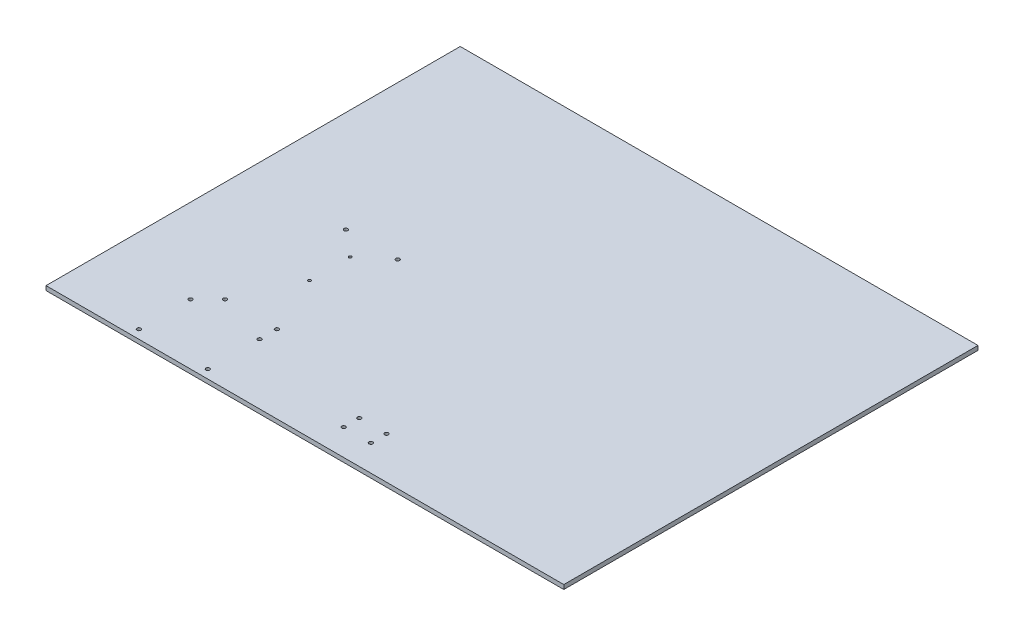
ISO-10303-21;
HEADER;
FILE_DESCRIPTION(('STEP AP214'),'2;1');
FILE_NAME('part.step','',(''),(''),'','','');
FILE_SCHEMA(('AUTOMOTIVE_DESIGN { 1 0 10303 214 1 1 1 1 }'));
ENDSEC;
DATA;
#1=APPLICATION_CONTEXT('core data for automotive mechanical design processes');
#2=APPLICATION_PROTOCOL_DEFINITION('international standard','automotive_design',2000,#1);
#3=PRODUCT_CONTEXT('',#1,'mechanical');
#4=PRODUCT('Part','Part','',(#3));
#5=PRODUCT_RELATED_PRODUCT_CATEGORY('part','',(#4));
#6=PRODUCT_DEFINITION_FORMATION('','',#4);
#7=PRODUCT_DEFINITION_CONTEXT('part definition',#1,'design');
#8=PRODUCT_DEFINITION('design','',#6,#7);
#9=PRODUCT_DEFINITION_SHAPE('','',#8);
#10=(LENGTH_UNIT() NAMED_UNIT(*) SI_UNIT(.MILLI.,.METRE.));
#11=(NAMED_UNIT(*) PLANE_ANGLE_UNIT() SI_UNIT($,.RADIAN.));
#12=(NAMED_UNIT(*) SI_UNIT($,.STERADIAN.) SOLID_ANGLE_UNIT());
#13=UNCERTAINTY_MEASURE_WITH_UNIT(LENGTH_MEASURE(1.E-05),#10,'distance_accuracy_value','');
#14=(GEOMETRIC_REPRESENTATION_CONTEXT(3) GLOBAL_UNCERTAINTY_ASSIGNED_CONTEXT((#13)) GLOBAL_UNIT_ASSIGNED_CONTEXT((#10,
#11,#12)) REPRESENTATION_CONTEXT('',''));
#15=CARTESIAN_POINT('',(0.,0.,0.));
#16=DIRECTION('',(0.,0.,1.));
#17=DIRECTION('',(1.,0.,0.));
#18=AXIS2_PLACEMENT_3D('',#15,#16,#17);
#19=CARTESIAN_POINT('',(0.,0.,0.));
#20=DIRECTION('',(0.,-1.,0.));
#21=DIRECTION('',(0.,0.,-1.));
#22=AXIS2_PLACEMENT_3D('',#19,#20,#21);
#23=PLANE('',#22);
#24=CARTESIAN_POINT('',(187.3758,0.,-260.35));
#25=DIRECTION('',(0.,1.,0.));
#26=DIRECTION('',(0.,0.,1.));
#27=AXIS2_PLACEMENT_3D('',#24,#25,#26);
#28=CIRCLE('',#27,2.09999999999999);
#29=CARTESIAN_POINT('',(187.3758,0.,-258.25));
#30=VERTEX_POINT('',#29);
#31=EDGE_CURVE('E196',#30,#30,#28,.T.);
#32=ORIENTED_EDGE('',*,*,#31,.T.);
#33=EDGE_LOOP('',(#32));
#34=FACE_BOUND('',#33,.T.);
#35=CARTESIAN_POINT('',(187.3758,0.,-200.3552));
#36=DIRECTION('',(0.,1.,0.));
#37=DIRECTION('',(0.,0.,1.));
#38=AXIS2_PLACEMENT_3D('',#35,#36,#37);
#39=CIRCLE('',#38,2.09999999999999);
#40=CARTESIAN_POINT('',(187.3758,0.,-198.2552));
#41=VERTEX_POINT('',#40);
#42=EDGE_CURVE('E190',#41,#41,#39,.T.);
#43=ORIENTED_EDGE('',*,*,#42,.T.);
#44=EDGE_LOOP('',(#43));
#45=FACE_BOUND('',#44,.T.);
#46=CARTESIAN_POINT('',(123.8758,0.,-12.7));
#47=DIRECTION('',(0.,1.,0.));
#48=DIRECTION('',(0.,0.,1.));
#49=AXIS2_PLACEMENT_3D('',#46,#47,#48);
#50=CIRCLE('',#49,2.74999999999999);
#51=CARTESIAN_POINT('',(123.8758,0.,-9.95000000000001));
#52=VERTEX_POINT('',#51);
#53=EDGE_CURVE('E184',#52,#52,#50,.T.);
#54=ORIENTED_EDGE('',*,*,#53,.T.);
#55=EDGE_LOOP('',(#54));
#56=FACE_BOUND('',#55,.T.);
#57=CARTESIAN_POINT('',(225.4758,0.,-12.7));
#58=DIRECTION('',(0.,1.,0.));
#59=DIRECTION('',(0.,0.,1.));
#60=AXIS2_PLACEMENT_3D('',#57,#58,#59);
#61=CIRCLE('',#60,2.75);
#62=CARTESIAN_POINT('',(225.4758,0.,-9.94999999999998));
#63=VERTEX_POINT('',#62);
#64=EDGE_CURVE('E178',#63,#63,#61,.T.);
#65=ORIENTED_EDGE('',*,*,#64,.T.);
#66=EDGE_LOOP('',(#65));
#67=FACE_BOUND('',#66,.T.);
#68=CARTESIAN_POINT('',(225.4758,0.,-88.9));
#69=DIRECTION('',(0.,1.,0.));
#70=DIRECTION('',(0.,0.,1.));
#71=AXIS2_PLACEMENT_3D('',#68,#69,#70);
#72=CIRCLE('',#71,2.75);
#73=CARTESIAN_POINT('',(225.4758,0.,-86.15));
#74=VERTEX_POINT('',#73);
#75=EDGE_CURVE('E172',#74,#74,#72,.T.);
#76=ORIENTED_EDGE('',*,*,#75,.T.);
#77=EDGE_LOOP('',(#76));
#78=FACE_BOUND('',#77,.T.);
#79=CARTESIAN_POINT('',(225.4758,0.,-292.1));
#80=DIRECTION('',(0.,1.,0.));
#81=DIRECTION('',(0.,0.,1.));
#82=AXIS2_PLACEMENT_3D('',#79,#80,#81);
#83=CIRCLE('',#82,2.75);
#84=CARTESIAN_POINT('',(225.4758,0.,-289.35));
#85=VERTEX_POINT('',#84);
#86=EDGE_CURVE('E154',#85,#85,#83,.T.);
#87=ORIENTED_EDGE('',*,*,#86,.T.);
#88=EDGE_LOOP('',(#87));
#89=FACE_BOUND('',#88,.T.);
#90=CARTESIAN_POINT('',(149.2758,0.,-292.1));
#91=DIRECTION('',(0.,1.,0.));
#92=DIRECTION('',(0.,0.,1.));
#93=AXIS2_PLACEMENT_3D('',#90,#91,#92);
#94=CIRCLE('',#93,2.75);
#95=CARTESIAN_POINT('',(149.2758,0.,-289.35));
#96=VERTEX_POINT('',#95);
#97=EDGE_CURVE('E148',#96,#96,#94,.T.);
#98=ORIENTED_EDGE('',*,*,#97,.T.);
#99=EDGE_LOOP('',(#98));
#100=FACE_BOUND('',#99,.T.);
#101=CARTESIAN_POINT('',(149.2758,0.,-114.3));
#102=DIRECTION('',(0.,1.,0.));
#103=DIRECTION('',(0.,0.,1.));
#104=AXIS2_PLACEMENT_3D('',#101,#102,#103);
#105=CIRCLE('',#104,2.75);
#106=CARTESIAN_POINT('',(149.2758,0.,-111.55));
#107=VERTEX_POINT('',#106);
#108=EDGE_CURVE('E142',#107,#107,#105,.T.);
#109=ORIENTED_EDGE('',*,*,#108,.T.);
#110=EDGE_LOOP('',(#109));
#111=FACE_BOUND('',#110,.T.);
#112=CARTESIAN_POINT('',(439.4454,0.,-61.6712));
#113=DIRECTION('',(0.,1.,0.));
#114=DIRECTION('',(0.,0.,1.));
#115=AXIS2_PLACEMENT_3D('',#112,#113,#114);
#116=CIRCLE('',#115,2.74999999999997);
#117=CARTESIAN_POINT('',(439.4454,0.,-58.9212));
#118=VERTEX_POINT('',#117);
#119=EDGE_CURVE('E136',#118,#118,#116,.T.);
#120=ORIENTED_EDGE('',*,*,#119,.T.);
#121=EDGE_LOOP('',(#120));
#122=FACE_BOUND('',#121,.T.);
#123=CARTESIAN_POINT('',(399.4404,0.,-61.6712));
#124=DIRECTION('',(0.,1.,0.));
#125=DIRECTION('',(0.,0.,1.));
#126=AXIS2_PLACEMENT_3D('',#123,#124,#125);
#127=CIRCLE('',#126,2.74999999999997);
#128=CARTESIAN_POINT('',(399.4404,0.,-58.9212000000001));
#129=VERTEX_POINT('',#128);
#130=EDGE_CURVE('E130',#129,#129,#127,.T.);
#131=ORIENTED_EDGE('',*,*,#130,.T.);
#132=EDGE_LOOP('',(#131));
#133=FACE_BOUND('',#132,.T.);
#134=CARTESIAN_POINT('',(399.4404,0.,-38.6588));
#135=DIRECTION('',(0.,1.,0.));
#136=DIRECTION('',(0.,0.,1.));
#137=AXIS2_PLACEMENT_3D('',#134,#135,#136);
#138=CIRCLE('',#137,2.74999999999997);
#139=CARTESIAN_POINT('',(399.4404,0.,-35.9088));
#140=VERTEX_POINT('',#139);
#141=EDGE_CURVE('E124',#140,#140,#138,.T.);
#142=ORIENTED_EDGE('',*,*,#141,.T.);
#143=EDGE_LOOP('',(#142));
#144=FACE_BOUND('',#143,.T.);
#145=CARTESIAN_POINT('',(439.4454,0.,-38.6588));
#146=DIRECTION('',(0.,1.,0.));
#147=DIRECTION('',(0.,0.,1.));
#148=AXIS2_PLACEMENT_3D('',#145,#146,#147);
#149=CIRCLE('',#148,2.74999999999997);
#150=CARTESIAN_POINT('',(439.4454,0.,-35.9088));
#151=VERTEX_POINT('',#150);
#152=EDGE_CURVE('E108',#151,#151,#149,.T.);
#153=ORIENTED_EDGE('',*,*,#152,.T.);
#154=EDGE_LOOP('',(#153));
#155=FACE_BOUND('',#154,.T.);
#156=DIRECTION('',(0.,0.,1.));
#157=VECTOR('',#156,1.);
#158=CARTESIAN_POINT('',(0.,0.,0.));
#159=LINE('',#158,#157);
#160=CARTESIAN_POINT('',(0.,0.,-609.6));
#161=VERTEX_POINT('',#160);
#162=CARTESIAN_POINT('',(0.,0.,0.));
#163=VERTEX_POINT('',#162);
#164=EDGE_CURVE('E105',#161,#163,#159,.T.);
#165=ORIENTED_EDGE('',*,*,#164,.F.);
#166=DIRECTION('',(-1.,0.,0.));
#167=VECTOR('',#166,1.);
#168=CARTESIAN_POINT('',(0.,0.,-609.6));
#169=LINE('',#168,#167);
#170=CARTESIAN_POINT('',(762.,0.,-609.6));
#171=VERTEX_POINT('',#170);
#172=EDGE_CURVE('E80',#171,#161,#169,.T.);
#173=ORIENTED_EDGE('',*,*,#172,.F.);
#174=DIRECTION('',(0.,0.,-1.));
#175=VECTOR('',#174,1.);
#176=CARTESIAN_POINT('',(762.,0.,0.));
#177=LINE('',#176,#175);
#178=CARTESIAN_POINT('',(762.,0.,0.));
#179=VERTEX_POINT('',#178);
#180=EDGE_CURVE('E74',#179,#171,#177,.T.);
#181=ORIENTED_EDGE('',*,*,#180,.F.);
#182=DIRECTION('',(1.,0.,0.));
#183=VECTOR('',#182,1.);
#184=CARTESIAN_POINT('',(0.,0.,0.));
#185=LINE('',#184,#183);
#186=EDGE_CURVE('E97',#163,#179,#185,.T.);
#187=ORIENTED_EDGE('',*,*,#186,.F.);
#188=EDGE_LOOP('',(#165,#173,#181,#187));
#189=FACE_BOUND('',#188,.T.);
#190=CARTESIAN_POINT('',(225.4758,0.,-114.3));
#191=DIRECTION('',(0.,1.,0.));
#192=DIRECTION('',(0.,0.,1.));
#193=AXIS2_PLACEMENT_3D('',#190,#191,#192);
#194=CIRCLE('',#193,2.75);
#195=CARTESIAN_POINT('',(225.4758,0.,-111.55));
#196=VERTEX_POINT('',#195);
#197=EDGE_CURVE('E160',#196,#196,#194,.T.);
#198=ORIENTED_EDGE('',*,*,#197,.T.);
#199=EDGE_LOOP('',(#198));
#200=FACE_BOUND('',#199,.T.);
#201=CARTESIAN_POINT('',(123.8758,0.,-88.9));
#202=DIRECTION('',(0.,1.,0.));
#203=DIRECTION('',(0.,0.,1.));
#204=AXIS2_PLACEMENT_3D('',#201,#202,#203);
#205=CIRCLE('',#204,2.74999999999999);
#206=CARTESIAN_POINT('',(123.8758,0.,-86.15));
#207=VERTEX_POINT('',#206);
#208=EDGE_CURVE('E166',#207,#207,#205,.T.);
#209=ORIENTED_EDGE('',*,*,#208,.T.);
#210=EDGE_LOOP('',(#209));
#211=FACE_BOUND('',#210,.T.);
#212=ADVANCED_FACE('F40',(#34,#45,#56,#67,#78,#89,#100,#111,#122,#133,#144,#155,#189,#200,#211),
#23,.T.);
#213=CARTESIAN_POINT('',(0.,6.35,0.));
#214=DIRECTION('',(0.,-1.,0.));
#215=DIRECTION('',(0.,0.,-1.));
#216=AXIS2_PLACEMENT_3D('',#213,#214,#215);
#217=PLANE('',#216);
#218=CARTESIAN_POINT('',(187.3758,6.35,-260.35));
#219=DIRECTION('',(0.,1.,0.));
#220=DIRECTION('',(0.,0.,1.));
#221=AXIS2_PLACEMENT_3D('',#218,#219,#220);
#222=CIRCLE('',#221,2.09999999999999);
#223=CARTESIAN_POINT('',(187.3758,6.35,-258.25));
#224=VERTEX_POINT('',#223);
#225=EDGE_CURVE('E199',#224,#224,#222,.T.);
#226=ORIENTED_EDGE('',*,*,#225,.F.);
#227=EDGE_LOOP('',(#226));
#228=FACE_BOUND('',#227,.T.);
#229=CARTESIAN_POINT('',(187.3758,6.35,-200.3552));
#230=DIRECTION('',(0.,1.,0.));
#231=DIRECTION('',(0.,0.,1.));
#232=AXIS2_PLACEMENT_3D('',#229,#230,#231);
#233=CIRCLE('',#232,2.09999999999999);
#234=CARTESIAN_POINT('',(187.3758,6.35,-198.2552));
#235=VERTEX_POINT('',#234);
#236=EDGE_CURVE('E193',#235,#235,#233,.T.);
#237=ORIENTED_EDGE('',*,*,#236,.F.);
#238=EDGE_LOOP('',(#237));
#239=FACE_BOUND('',#238,.T.);
#240=CARTESIAN_POINT('',(123.8758,6.35,-12.7));
#241=DIRECTION('',(0.,1.,0.));
#242=DIRECTION('',(0.,0.,1.));
#243=AXIS2_PLACEMENT_3D('',#240,#241,#242);
#244=CIRCLE('',#243,2.74999999999999);
#245=CARTESIAN_POINT('',(123.8758,6.35,-9.95000000000001));
#246=VERTEX_POINT('',#245);
#247=EDGE_CURVE('E187',#246,#246,#244,.T.);
#248=ORIENTED_EDGE('',*,*,#247,.F.);
#249=EDGE_LOOP('',(#248));
#250=FACE_BOUND('',#249,.T.);
#251=CARTESIAN_POINT('',(225.4758,6.35,-12.7));
#252=DIRECTION('',(0.,1.,0.));
#253=DIRECTION('',(0.,0.,1.));
#254=AXIS2_PLACEMENT_3D('',#251,#252,#253);
#255=CIRCLE('',#254,2.74999999999997);
#256=CARTESIAN_POINT('',(225.4758,6.35,-9.95));
#257=VERTEX_POINT('',#256);
#258=EDGE_CURVE('E181',#257,#257,#255,.T.);
#259=ORIENTED_EDGE('',*,*,#258,.F.);
#260=EDGE_LOOP('',(#259));
#261=FACE_BOUND('',#260,.T.);
#262=CARTESIAN_POINT('',(225.4758,6.35,-88.9));
#263=DIRECTION('',(0.,1.,0.));
#264=DIRECTION('',(0.,0.,1.));
#265=AXIS2_PLACEMENT_3D('',#262,#263,#264);
#266=CIRCLE('',#265,2.74999999999997);
#267=CARTESIAN_POINT('',(225.4758,6.35,-86.15));
#268=VERTEX_POINT('',#267);
#269=EDGE_CURVE('E175',#268,#268,#266,.T.);
#270=ORIENTED_EDGE('',*,*,#269,.F.);
#271=EDGE_LOOP('',(#270));
#272=FACE_BOUND('',#271,.T.);
#273=CARTESIAN_POINT('',(123.8758,6.35,-88.9));
#274=DIRECTION('',(0.,1.,0.));
#275=DIRECTION('',(0.,0.,1.));
#276=AXIS2_PLACEMENT_3D('',#273,#274,#275);
#277=CIRCLE('',#276,2.74999999999999);
#278=CARTESIAN_POINT('',(123.8758,6.35,-86.15));
#279=VERTEX_POINT('',#278);
#280=EDGE_CURVE('E169',#279,#279,#277,.T.);
#281=ORIENTED_EDGE('',*,*,#280,.F.);
#282=EDGE_LOOP('',(#281));
#283=FACE_BOUND('',#282,.T.);
#284=CARTESIAN_POINT('',(225.4758,6.35,-292.1));
#285=DIRECTION('',(0.,1.,0.));
#286=DIRECTION('',(0.,0.,1.));
#287=AXIS2_PLACEMENT_3D('',#284,#285,#286);
#288=CIRCLE('',#287,2.74999999999997);
#289=CARTESIAN_POINT('',(225.4758,6.35,-289.35));
#290=VERTEX_POINT('',#289);
#291=EDGE_CURVE('E157',#290,#290,#288,.T.);
#292=ORIENTED_EDGE('',*,*,#291,.F.);
#293=EDGE_LOOP('',(#292));
#294=FACE_BOUND('',#293,.T.);
#295=CARTESIAN_POINT('',(149.2758,6.35,-292.1));
#296=DIRECTION('',(0.,1.,0.));
#297=DIRECTION('',(0.,0.,1.));
#298=AXIS2_PLACEMENT_3D('',#295,#296,#297);
#299=CIRCLE('',#298,2.74999999999997);
#300=CARTESIAN_POINT('',(149.2758,6.35,-289.35));
#301=VERTEX_POINT('',#300);
#302=EDGE_CURVE('E151',#301,#301,#299,.T.);
#303=ORIENTED_EDGE('',*,*,#302,.F.);
#304=EDGE_LOOP('',(#303));
#305=FACE_BOUND('',#304,.T.);
#306=CARTESIAN_POINT('',(149.2758,6.35,-114.3));
#307=DIRECTION('',(0.,1.,0.));
#308=DIRECTION('',(0.,0.,1.));
#309=AXIS2_PLACEMENT_3D('',#306,#307,#308);
#310=CIRCLE('',#309,2.74999999999997);
#311=CARTESIAN_POINT('',(149.2758,6.35,-111.55));
#312=VERTEX_POINT('',#311);
#313=EDGE_CURVE('E145',#312,#312,#310,.T.);
#314=ORIENTED_EDGE('',*,*,#313,.F.);
#315=EDGE_LOOP('',(#314));
#316=FACE_BOUND('',#315,.T.);
#317=CARTESIAN_POINT('',(439.4454,6.35,-61.6712));
#318=DIRECTION('',(0.,1.,0.));
#319=DIRECTION('',(0.,0.,1.));
#320=AXIS2_PLACEMENT_3D('',#317,#318,#319);
#321=CIRCLE('',#320,2.74999999999997);
#322=CARTESIAN_POINT('',(439.4454,6.35,-58.9212));
#323=VERTEX_POINT('',#322);
#324=EDGE_CURVE('E139',#323,#323,#321,.T.);
#325=ORIENTED_EDGE('',*,*,#324,.F.);
#326=EDGE_LOOP('',(#325));
#327=FACE_BOUND('',#326,.T.);
#328=CARTESIAN_POINT('',(399.4404,6.35,-61.6712));
#329=DIRECTION('',(0.,1.,0.));
#330=DIRECTION('',(0.,0.,1.));
#331=AXIS2_PLACEMENT_3D('',#328,#329,#330);
#332=CIRCLE('',#331,2.74999999999997);
#333=CARTESIAN_POINT('',(399.4404,6.35,-58.9212000000001));
#334=VERTEX_POINT('',#333);
#335=EDGE_CURVE('E133',#334,#334,#332,.T.);
#336=ORIENTED_EDGE('',*,*,#335,.F.);
#337=EDGE_LOOP('',(#336));
#338=FACE_BOUND('',#337,.T.);
#339=CARTESIAN_POINT('',(399.4404,6.35,-38.6588));
#340=DIRECTION('',(0.,1.,0.));
#341=DIRECTION('',(0.,0.,1.));
#342=AXIS2_PLACEMENT_3D('',#339,#340,#341);
#343=CIRCLE('',#342,2.74999999999997);
#344=CARTESIAN_POINT('',(399.4404,6.35,-35.9088));
#345=VERTEX_POINT('',#344);
#346=EDGE_CURVE('E127',#345,#345,#343,.T.);
#347=ORIENTED_EDGE('',*,*,#346,.F.);
#348=EDGE_LOOP('',(#347));
#349=FACE_BOUND('',#348,.T.);
#350=CARTESIAN_POINT('',(439.4454,6.35,-38.6588));
#351=DIRECTION('',(0.,1.,0.));
#352=DIRECTION('',(0.,0.,1.));
#353=AXIS2_PLACEMENT_3D('',#350,#351,#352);
#354=CIRCLE('',#353,2.74999999999997);
#355=CARTESIAN_POINT('',(439.4454,6.35,-35.9088));
#356=VERTEX_POINT('',#355);
#357=EDGE_CURVE('E121',#356,#356,#354,.T.);
#358=ORIENTED_EDGE('',*,*,#357,.F.);
#359=EDGE_LOOP('',(#358));
#360=FACE_BOUND('',#359,.T.);
#361=DIRECTION('',(0.,0.,1.));
#362=VECTOR('',#361,1.);
#363=CARTESIAN_POINT('',(0.,6.35,0.));
#364=LINE('',#363,#362);
#365=CARTESIAN_POINT('',(0.,6.35,-609.6));
#366=VERTEX_POINT('',#365);
#367=CARTESIAN_POINT('',(0.,6.35,0.));
#368=VERTEX_POINT('',#367);
#369=EDGE_CURVE('E93',#366,#368,#364,.T.);
#370=ORIENTED_EDGE('',*,*,#369,.T.);
#371=DIRECTION('',(1.,0.,0.));
#372=VECTOR('',#371,1.);
#373=CARTESIAN_POINT('',(0.,6.35,0.));
#374=LINE('',#373,#372);
#375=CARTESIAN_POINT('',(762.,6.35,0.));
#376=VERTEX_POINT('',#375);
#377=EDGE_CURVE('E87',#368,#376,#374,.T.);
#378=ORIENTED_EDGE('',*,*,#377,.T.);
#379=DIRECTION('',(0.,0.,-1.));
#380=VECTOR('',#379,1.);
#381=CARTESIAN_POINT('',(762.,6.35,0.));
#382=LINE('',#381,#380);
#383=CARTESIAN_POINT('',(762.,6.35,-609.6));
#384=VERTEX_POINT('',#383);
#385=EDGE_CURVE('E91',#376,#384,#382,.T.);
#386=ORIENTED_EDGE('',*,*,#385,.T.);
#387=DIRECTION('',(-1.,0.,0.));
#388=VECTOR('',#387,1.);
#389=CARTESIAN_POINT('',(0.,6.35,-609.6));
#390=LINE('',#389,#388);
#391=EDGE_CURVE('E57',#384,#366,#390,.T.);
#392=ORIENTED_EDGE('',*,*,#391,.T.);
#393=EDGE_LOOP('',(#370,#378,#386,#392));
#394=FACE_BOUND('',#393,.T.);
#395=CARTESIAN_POINT('',(225.4758,6.35,-114.3));
#396=DIRECTION('',(0.,1.,0.));
#397=DIRECTION('',(0.,0.,1.));
#398=AXIS2_PLACEMENT_3D('',#395,#396,#397);
#399=CIRCLE('',#398,2.74999999999997);
#400=CARTESIAN_POINT('',(225.4758,6.35,-111.55));
#401=VERTEX_POINT('',#400);
#402=EDGE_CURVE('E163',#401,#401,#399,.T.);
#403=ORIENTED_EDGE('',*,*,#402,.F.);
#404=EDGE_LOOP('',(#403));
#405=FACE_BOUND('',#404,.T.);
#406=ADVANCED_FACE('F88',(#228,#239,#250,#261,#272,#283,#294,#305,#316,#327,#338,#349,#360,#394,
#405),#217,.F.);
#407=CARTESIAN_POINT('',(0.,6.35,0.));
#408=DIRECTION('',(1.,0.,0.));
#409=DIRECTION('',(0.,0.,-1.));
#410=AXIS2_PLACEMENT_3D('',#407,#408,#409);
#411=PLANE('',#410);
#412=ORIENTED_EDGE('',*,*,#164,.T.);
#413=DIRECTION('',(0.,-1.,0.));
#414=VECTOR('',#413,1.);
#415=CARTESIAN_POINT('',(0.,6.35,0.));
#416=LINE('',#415,#414);
#417=EDGE_CURVE('E11',#368,#163,#416,.T.);
#418=ORIENTED_EDGE('',*,*,#417,.F.);
#419=ORIENTED_EDGE('',*,*,#369,.F.);
#420=DIRECTION('',(0.,-1.,0.));
#421=VECTOR('',#420,1.);
#422=CARTESIAN_POINT('',(0.,6.35,-609.6));
#423=LINE('',#422,#421);
#424=EDGE_CURVE('E101',#366,#161,#423,.T.);
#425=ORIENTED_EDGE('',*,*,#424,.T.);
#426=EDGE_LOOP('',(#412,#418,#419,#425));
#427=FACE_BOUND('',#426,.T.);
#428=ADVANCED_FACE('F42',(#427),#411,.F.);
#429=CARTESIAN_POINT('',(0.,6.35,0.));
#430=DIRECTION('',(0.,0.,-1.));
#431=DIRECTION('',(-1.,0.,0.));
#432=AXIS2_PLACEMENT_3D('',#429,#430,#431);
#433=PLANE('',#432);
#434=ORIENTED_EDGE('',*,*,#186,.T.);
#435=DIRECTION('',(0.,-1.,0.));
#436=VECTOR('',#435,1.);
#437=CARTESIAN_POINT('',(762.,6.35,0.));
#438=LINE('',#437,#436);
#439=EDGE_CURVE('E49',#376,#179,#438,.T.);
#440=ORIENTED_EDGE('',*,*,#439,.F.);
#441=ORIENTED_EDGE('',*,*,#377,.F.);
#442=ORIENTED_EDGE('',*,*,#417,.T.);
#443=EDGE_LOOP('',(#434,#440,#441,#442));
#444=FACE_BOUND('',#443,.T.);
#445=ADVANCED_FACE('F96',(#444),#433,.F.);
#446=CARTESIAN_POINT('',(762.,6.35,0.));
#447=DIRECTION('',(-1.,0.,0.));
#448=DIRECTION('',(0.,0.,1.));
#449=AXIS2_PLACEMENT_3D('',#446,#447,#448);
#450=PLANE('',#449);
#451=ORIENTED_EDGE('',*,*,#180,.T.);
#452=DIRECTION('',(0.,-1.,0.));
#453=VECTOR('',#452,1.);
#454=CARTESIAN_POINT('',(762.,6.35,-609.6));
#455=LINE('',#454,#453);
#456=EDGE_CURVE('E98',#384,#171,#455,.T.);
#457=ORIENTED_EDGE('',*,*,#456,.F.);
#458=ORIENTED_EDGE('',*,*,#385,.F.);
#459=ORIENTED_EDGE('',*,*,#439,.T.);
#460=EDGE_LOOP('',(#451,#457,#458,#459));
#461=FACE_BOUND('',#460,.T.);
#462=ADVANCED_FACE('F99',(#461),#450,.F.);
#463=CARTESIAN_POINT('',(0.,6.35,-609.6));
#464=DIRECTION('',(0.,0.,1.));
#465=DIRECTION('',(1.,0.,0.));
#466=AXIS2_PLACEMENT_3D('',#463,#464,#465);
#467=PLANE('',#466);
#468=ORIENTED_EDGE('',*,*,#172,.T.);
#469=ORIENTED_EDGE('',*,*,#424,.F.);
#470=ORIENTED_EDGE('',*,*,#391,.F.);
#471=ORIENTED_EDGE('',*,*,#456,.T.);
#472=EDGE_LOOP('',(#468,#469,#470,#471));
#473=FACE_BOUND('',#472,.T.);
#474=ADVANCED_FACE('F113',(#473),#467,.F.);
#475=CARTESIAN_POINT('',(439.4454,6.35,-38.6588));
#476=DIRECTION('',(0.,1.,0.));
#477=DIRECTION('',(0.,0.,1.));
#478=AXIS2_PLACEMENT_3D('',#475,#476,#477);
#479=CYLINDRICAL_SURFACE('',#478,2.74999999999997);
#480=ORIENTED_EDGE('',*,*,#152,.F.);
#481=EDGE_LOOP('',(#480));
#482=FACE_BOUND('',#481,.T.);
#483=ORIENTED_EDGE('',*,*,#357,.T.);
#484=EDGE_LOOP('',(#483));
#485=FACE_BOUND('',#484,.T.);
#486=ADVANCED_FACE('F232',(#482,#485),#479,.F.);
#487=CARTESIAN_POINT('',(399.4404,6.35,-38.6588));
#488=DIRECTION('',(0.,1.,0.));
#489=DIRECTION('',(0.,0.,1.));
#490=AXIS2_PLACEMENT_3D('',#487,#488,#489);
#491=CYLINDRICAL_SURFACE('',#490,2.74999999999997);
#492=ORIENTED_EDGE('',*,*,#141,.F.);
#493=EDGE_LOOP('',(#492));
#494=FACE_BOUND('',#493,.T.);
#495=ORIENTED_EDGE('',*,*,#346,.T.);
#496=EDGE_LOOP('',(#495));
#497=FACE_BOUND('',#496,.T.);
#498=ADVANCED_FACE('F234',(#494,#497),#491,.F.);
#499=CARTESIAN_POINT('',(399.4404,6.35,-61.6712));
#500=DIRECTION('',(0.,1.,0.));
#501=DIRECTION('',(0.,0.,1.));
#502=AXIS2_PLACEMENT_3D('',#499,#500,#501);
#503=CYLINDRICAL_SURFACE('',#502,2.74999999999997);
#504=ORIENTED_EDGE('',*,*,#130,.F.);
#505=EDGE_LOOP('',(#504));
#506=FACE_BOUND('',#505,.T.);
#507=ORIENTED_EDGE('',*,*,#335,.T.);
#508=EDGE_LOOP('',(#507));
#509=FACE_BOUND('',#508,.T.);
#510=ADVANCED_FACE('F241',(#506,#509),#503,.F.);
#511=CARTESIAN_POINT('',(439.4454,6.35,-61.6712));
#512=DIRECTION('',(0.,1.,0.));
#513=DIRECTION('',(0.,0.,1.));
#514=AXIS2_PLACEMENT_3D('',#511,#512,#513);
#515=CYLINDRICAL_SURFACE('',#514,2.74999999999997);
#516=ORIENTED_EDGE('',*,*,#119,.F.);
#517=EDGE_LOOP('',(#516));
#518=FACE_BOUND('',#517,.T.);
#519=ORIENTED_EDGE('',*,*,#324,.T.);
#520=EDGE_LOOP('',(#519));
#521=FACE_BOUND('',#520,.T.);
#522=ADVANCED_FACE('F302',(#518,#521),#515,.F.);
#523=CARTESIAN_POINT('',(149.2758,6.35,-114.3));
#524=DIRECTION('',(0.,1.,0.));
#525=DIRECTION('',(0.,0.,1.));
#526=AXIS2_PLACEMENT_3D('',#523,#524,#525);
#527=CYLINDRICAL_SURFACE('',#526,2.74999999999999);
#528=ORIENTED_EDGE('',*,*,#108,.F.);
#529=EDGE_LOOP('',(#528));
#530=FACE_BOUND('',#529,.T.);
#531=ORIENTED_EDGE('',*,*,#313,.T.);
#532=EDGE_LOOP('',(#531));
#533=FACE_BOUND('',#532,.T.);
#534=ADVANCED_FACE('F313',(#530,#533),#527,.F.);
#535=CARTESIAN_POINT('',(149.2758,6.35,-292.1));
#536=DIRECTION('',(0.,1.,0.));
#537=DIRECTION('',(0.,0.,1.));
#538=AXIS2_PLACEMENT_3D('',#535,#536,#537);
#539=CYLINDRICAL_SURFACE('',#538,2.74999999999999);
#540=ORIENTED_EDGE('',*,*,#97,.F.);
#541=EDGE_LOOP('',(#540));
#542=FACE_BOUND('',#541,.T.);
#543=ORIENTED_EDGE('',*,*,#302,.T.);
#544=EDGE_LOOP('',(#543));
#545=FACE_BOUND('',#544,.T.);
#546=ADVANCED_FACE('F326',(#542,#545),#539,.F.);
#547=CARTESIAN_POINT('',(225.4758,6.35,-292.1));
#548=DIRECTION('',(0.,1.,0.));
#549=DIRECTION('',(0.,0.,1.));
#550=AXIS2_PLACEMENT_3D('',#547,#548,#549);
#551=CYLINDRICAL_SURFACE('',#550,2.74999999999999);
#552=ORIENTED_EDGE('',*,*,#86,.F.);
#553=EDGE_LOOP('',(#552));
#554=FACE_BOUND('',#553,.T.);
#555=ORIENTED_EDGE('',*,*,#291,.T.);
#556=EDGE_LOOP('',(#555));
#557=FACE_BOUND('',#556,.T.);
#558=ADVANCED_FACE('F338',(#554,#557),#551,.F.);
#559=CARTESIAN_POINT('',(225.4758,6.35,-114.3));
#560=DIRECTION('',(0.,1.,0.));
#561=DIRECTION('',(0.,0.,1.));
#562=AXIS2_PLACEMENT_3D('',#559,#560,#561);
#563=CYLINDRICAL_SURFACE('',#562,2.74999999999999);
#564=ORIENTED_EDGE('',*,*,#197,.F.);
#565=EDGE_LOOP('',(#564));
#566=FACE_BOUND('',#565,.T.);
#567=ORIENTED_EDGE('',*,*,#402,.T.);
#568=EDGE_LOOP('',(#567));
#569=FACE_BOUND('',#568,.T.);
#570=ADVANCED_FACE('F349',(#566,#569),#563,.F.);
#571=CARTESIAN_POINT('',(123.8758,6.35,-88.9));
#572=DIRECTION('',(0.,1.,0.));
#573=DIRECTION('',(0.,0.,1.));
#574=AXIS2_PLACEMENT_3D('',#571,#572,#573);
#575=CYLINDRICAL_SURFACE('',#574,2.74999999999999);
#576=ORIENTED_EDGE('',*,*,#208,.F.);
#577=EDGE_LOOP('',(#576));
#578=FACE_BOUND('',#577,.T.);
#579=ORIENTED_EDGE('',*,*,#280,.T.);
#580=EDGE_LOOP('',(#579));
#581=FACE_BOUND('',#580,.T.);
#582=ADVANCED_FACE('F360',(#578,#581),#575,.F.);
#583=CARTESIAN_POINT('',(225.4758,6.35,-88.9));
#584=DIRECTION('',(0.,1.,0.));
#585=DIRECTION('',(0.,0.,1.));
#586=AXIS2_PLACEMENT_3D('',#583,#584,#585);
#587=CYLINDRICAL_SURFACE('',#586,2.74999999999999);
#588=ORIENTED_EDGE('',*,*,#75,.F.);
#589=EDGE_LOOP('',(#588));
#590=FACE_BOUND('',#589,.T.);
#591=ORIENTED_EDGE('',*,*,#269,.T.);
#592=EDGE_LOOP('',(#591));
#593=FACE_BOUND('',#592,.T.);
#594=ADVANCED_FACE('F371',(#590,#593),#587,.F.);
#595=CARTESIAN_POINT('',(225.4758,6.35,-12.7));
#596=DIRECTION('',(0.,1.,0.));
#597=DIRECTION('',(0.,0.,1.));
#598=AXIS2_PLACEMENT_3D('',#595,#596,#597);
#599=CYLINDRICAL_SURFACE('',#598,2.74999999999999);
#600=ORIENTED_EDGE('',*,*,#64,.F.);
#601=EDGE_LOOP('',(#600));
#602=FACE_BOUND('',#601,.T.);
#603=ORIENTED_EDGE('',*,*,#258,.T.);
#604=EDGE_LOOP('',(#603));
#605=FACE_BOUND('',#604,.T.);
#606=ADVANCED_FACE('F382',(#602,#605),#599,.F.);
#607=CARTESIAN_POINT('',(123.8758,6.35,-12.7));
#608=DIRECTION('',(0.,1.,0.));
#609=DIRECTION('',(0.,0.,1.));
#610=AXIS2_PLACEMENT_3D('',#607,#608,#609);
#611=CYLINDRICAL_SURFACE('',#610,2.74999999999999);
#612=ORIENTED_EDGE('',*,*,#53,.F.);
#613=EDGE_LOOP('',(#612));
#614=FACE_BOUND('',#613,.T.);
#615=ORIENTED_EDGE('',*,*,#247,.T.);
#616=EDGE_LOOP('',(#615));
#617=FACE_BOUND('',#616,.T.);
#618=ADVANCED_FACE('F392',(#614,#617),#611,.F.);
#619=CARTESIAN_POINT('',(187.3758,6.35,-200.3552));
#620=DIRECTION('',(0.,1.,0.));
#621=DIRECTION('',(0.,0.,1.));
#622=AXIS2_PLACEMENT_3D('',#619,#620,#621);
#623=CYLINDRICAL_SURFACE('',#622,2.09999999999999);
#624=ORIENTED_EDGE('',*,*,#42,.F.);
#625=EDGE_LOOP('',(#624));
#626=FACE_BOUND('',#625,.T.);
#627=ORIENTED_EDGE('',*,*,#236,.T.);
#628=EDGE_LOOP('',(#627));
#629=FACE_BOUND('',#628,.T.);
#630=ADVANCED_FACE('F402',(#626,#629),#623,.F.);
#631=CARTESIAN_POINT('',(187.3758,6.35,-260.35));
#632=DIRECTION('',(0.,1.,0.));
#633=DIRECTION('',(0.,0.,1.));
#634=AXIS2_PLACEMENT_3D('',#631,#632,#633);
#635=CYLINDRICAL_SURFACE('',#634,2.09999999999999);
#636=ORIENTED_EDGE('',*,*,#31,.F.);
#637=EDGE_LOOP('',(#636));
#638=FACE_BOUND('',#637,.T.);
#639=ORIENTED_EDGE('',*,*,#225,.T.);
#640=EDGE_LOOP('',(#639));
#641=FACE_BOUND('',#640,.T.);
#642=ADVANCED_FACE('F203',(#638,#641),#635,.F.);
#643=CLOSED_SHELL('',(#212,#406,#428,#445,#462,#474,#486,#498,#510,#522,#534,#546,#558,#570,
#582,#594,#606,#618,#630,#642));
#644=MANIFOLD_SOLID_BREP('B2',#643);
#645=ADVANCED_BREP_SHAPE_REPRESENTATION('',(#18,#644),#14);
#646=SHAPE_DEFINITION_REPRESENTATION(#9,#645);
ENDSEC;
END-ISO-10303-21;
